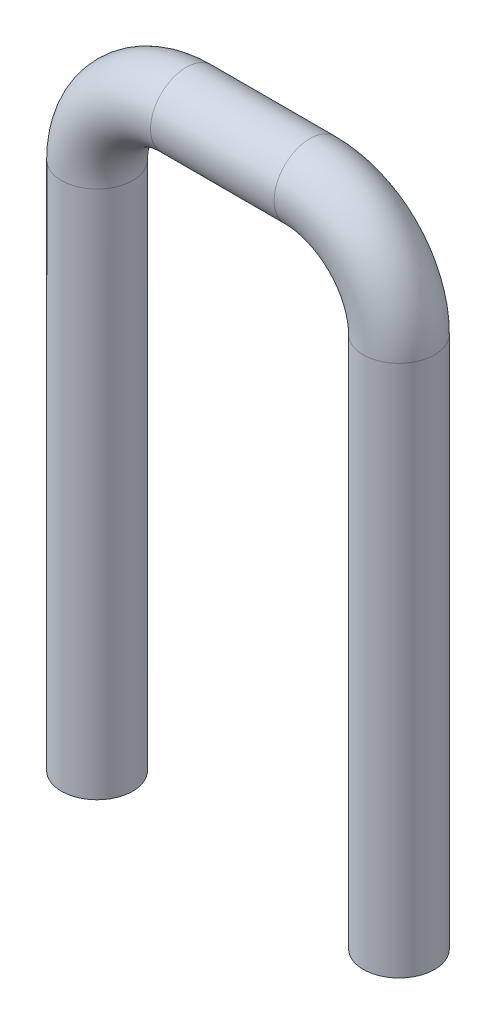
ISO-10303-21;
HEADER;
FILE_DESCRIPTION(('STEP AP214'),'2;1');
FILE_NAME('part.step','',(''),(''),'','','');
FILE_SCHEMA(('AUTOMOTIVE_DESIGN { 1 0 10303 214 1 1 1 1 }'));
ENDSEC;
DATA;
#1=APPLICATION_CONTEXT('core data for automotive mechanical design processes');
#2=APPLICATION_PROTOCOL_DEFINITION('international standard','automotive_design',2000,#1);
#3=PRODUCT_CONTEXT('',#1,'mechanical');
#4=PRODUCT('Part','Part','',(#3));
#5=PRODUCT_RELATED_PRODUCT_CATEGORY('part','',(#4));
#6=PRODUCT_DEFINITION_FORMATION('','',#4);
#7=PRODUCT_DEFINITION_CONTEXT('part definition',#1,'design');
#8=PRODUCT_DEFINITION('design','',#6,#7);
#9=PRODUCT_DEFINITION_SHAPE('','',#8);
#10=(LENGTH_UNIT() NAMED_UNIT(*) SI_UNIT(.MILLI.,.METRE.));
#11=(NAMED_UNIT(*) PLANE_ANGLE_UNIT() SI_UNIT($,.RADIAN.));
#12=(NAMED_UNIT(*) SI_UNIT($,.STERADIAN.) SOLID_ANGLE_UNIT());
#13=UNCERTAINTY_MEASURE_WITH_UNIT(LENGTH_MEASURE(1.E-05),#10,'distance_accuracy_value','');
#14=(GEOMETRIC_REPRESENTATION_CONTEXT(3) GLOBAL_UNCERTAINTY_ASSIGNED_CONTEXT((#13)) GLOBAL_UNIT_ASSIGNED_CONTEXT((#10,
#11,#12)) REPRESENTATION_CONTEXT('',''));
#15=CARTESIAN_POINT('',(0.,0.,0.));
#16=DIRECTION('',(0.,0.,1.));
#17=DIRECTION('',(1.,0.,0.));
#18=AXIS2_PLACEMENT_3D('',#15,#16,#17);
#19=CARTESIAN_POINT('',(0.,0.,0.));
#20=DIRECTION('',(0.,1.,0.));
#21=DIRECTION('',(0.,0.,1.));
#22=AXIS2_PLACEMENT_3D('',#19,#20,#21);
#23=CYLINDRICAL_SURFACE('',#22,0.3);
#24=CARTESIAN_POINT('',(0.,1.85,0.));
#25=DIRECTION('',(0.,1.,0.));
#26=DIRECTION('',(0.,0.,1.));
#27=AXIS2_PLACEMENT_3D('',#24,#25,#26);
#28=CIRCLE('',#27,0.3);
#29=CARTESIAN_POINT('',(-0.3,1.85,0.));
#30=VERTEX_POINT('',#29);
#31=EDGE_CURVE('E55',#30,#30,#28,.T.);
#32=ORIENTED_EDGE('',*,*,#31,.F.);
#33=EDGE_LOOP('',(#32));
#34=FACE_BOUND('',#33,.T.);
#35=CARTESIAN_POINT('',(0.,-2.6,0.));
#36=DIRECTION('',(0.,-1.,0.));
#37=DIRECTION('',(0.,0.,-1.));
#38=AXIS2_PLACEMENT_3D('',#35,#36,#37);
#39=CIRCLE('',#38,0.3);
#40=CARTESIAN_POINT('',(0.,-2.6,-0.3));
#41=VERTEX_POINT('',#40);
#42=EDGE_CURVE('E61',#41,#41,#39,.T.);
#43=ORIENTED_EDGE('',*,*,#42,.F.);
#44=EDGE_LOOP('',(#43));
#45=FACE_BOUND('',#44,.T.);
#46=ADVANCED_FACE('F37',(#34,#45),#23,.T.);
#47=CARTESIAN_POINT('',(0.75,1.85,0.));
#48=DIRECTION('',(0.,0.,-1.));
#49=DIRECTION('',(-1.,0.,0.));
#50=AXIS2_PLACEMENT_3D('',#47,#48,#49);
#51=TOROIDAL_SURFACE('',#50,0.75,0.3);
#52=CARTESIAN_POINT('',(0.75,2.6,0.));
#53=DIRECTION('',(1.,0.,0.));
#54=DIRECTION('',(0.,0.,1.));
#55=AXIS2_PLACEMENT_3D('',#52,#53,#54);
#56=CIRCLE('',#55,0.3);
#57=CARTESIAN_POINT('',(0.75,2.9,0.));
#58=VERTEX_POINT('',#57);
#59=EDGE_CURVE('E50',#58,#58,#56,.T.);
#60=CARTESIAN_POINT('',(0.75,1.85,0.));
#61=DIRECTION('',(0.,0.,-1.));
#62=DIRECTION('',(-1.,0.,0.));
#63=AXIS2_PLACEMENT_3D('',#60,#61,#62);
#64=CIRCLE('',#63,1.05);
#65=EDGE_CURVE('',#30,#58,#64,.T.);
#66=ORIENTED_EDGE('',*,*,#31,.T.);
#67=ORIENTED_EDGE('',*,*,#59,.F.);
#68=ORIENTED_EDGE('',*,*,#65,.T.);
#69=ORIENTED_EDGE('',*,*,#65,.F.);
#70=EDGE_LOOP('',(#66,#68,#67,#69));
#71=FACE_BOUND('',#70,.T.);
#72=ADVANCED_FACE('F86',(#71),#51,.T.);
#73=CARTESIAN_POINT('',(0.75,2.6,0.));
#74=DIRECTION('',(1.,0.,0.));
#75=DIRECTION('',(0.,0.,-1.));
#76=AXIS2_PLACEMENT_3D('',#73,#74,#75);
#77=CYLINDRICAL_SURFACE('',#76,0.3);
#78=CARTESIAN_POINT('',(1.79,2.6,0.));
#79=DIRECTION('',(1.,0.,0.));
#80=DIRECTION('',(0.,0.,1.));
#81=AXIS2_PLACEMENT_3D('',#78,#79,#80);
#82=CIRCLE('',#81,0.3);
#83=CARTESIAN_POINT('',(1.79,2.9,0.));
#84=VERTEX_POINT('',#83);
#85=EDGE_CURVE('E45',#84,#84,#82,.T.);
#86=ORIENTED_EDGE('',*,*,#85,.F.);
#87=EDGE_LOOP('',(#86));
#88=FACE_BOUND('',#87,.T.);
#89=ORIENTED_EDGE('',*,*,#59,.T.);
#90=EDGE_LOOP('',(#89));
#91=FACE_BOUND('',#90,.T.);
#92=ADVANCED_FACE('F81',(#88,#91),#77,.T.);
#93=CARTESIAN_POINT('',(1.79,1.85,0.));
#94=DIRECTION('',(0.,0.,-1.));
#95=DIRECTION('',(-1.,0.,0.));
#96=AXIS2_PLACEMENT_3D('',#93,#94,#95);
#97=TOROIDAL_SURFACE('',#96,0.75,0.3);
#98=CARTESIAN_POINT('',(2.54,1.85,0.));
#99=DIRECTION('',(0.,-1.,0.));
#100=DIRECTION('',(0.,0.,1.));
#101=AXIS2_PLACEMENT_3D('',#98,#99,#100);
#102=CIRCLE('',#101,0.3);
#103=CARTESIAN_POINT('',(2.84,1.85,0.));
#104=VERTEX_POINT('',#103);
#105=EDGE_CURVE('E10',#104,#104,#102,.T.);
#106=CARTESIAN_POINT('',(1.79,1.85,0.));
#107=DIRECTION('',(0.,0.,-1.));
#108=DIRECTION('',(-1.,0.,0.));
#109=AXIS2_PLACEMENT_3D('',#106,#107,#108);
#110=CIRCLE('',#109,1.05);
#111=EDGE_CURVE('',#84,#104,#110,.T.);
#112=ORIENTED_EDGE('',*,*,#85,.T.);
#113=ORIENTED_EDGE('',*,*,#105,.F.);
#114=ORIENTED_EDGE('',*,*,#111,.T.);
#115=ORIENTED_EDGE('',*,*,#111,.F.);
#116=EDGE_LOOP('',(#112,#114,#113,#115));
#117=FACE_BOUND('',#116,.T.);
#118=ADVANCED_FACE('F74',(#117),#97,.T.);
#119=CARTESIAN_POINT('',(2.54,1.85,0.));
#120=DIRECTION('',(0.,-1.,0.));
#121=DIRECTION('',(1.,0.,0.));
#122=AXIS2_PLACEMENT_3D('',#119,#120,#121);
#123=CYLINDRICAL_SURFACE('',#122,0.3);
#124=ORIENTED_EDGE('',*,*,#105,.T.);
#125=EDGE_LOOP('',(#124));
#126=FACE_BOUND('',#125,.T.);
#127=CARTESIAN_POINT('',(2.54,-2.6285295528343,0.));
#128=DIRECTION('',(0.,-1.,0.));
#129=DIRECTION('',(1.,0.,0.));
#130=AXIS2_PLACEMENT_3D('',#127,#128,#129);
#131=CIRCLE('',#130,0.3);
#132=CARTESIAN_POINT('',(2.84,-2.6285295528343,0.));
#133=VERTEX_POINT('',#132);
#134=EDGE_CURVE('E65',#133,#133,#131,.T.);
#135=ORIENTED_EDGE('',*,*,#134,.F.);
#136=EDGE_LOOP('',(#135));
#137=FACE_BOUND('',#136,.T.);
#138=ADVANCED_FACE('F39',(#126,#137),#123,.T.);
#139=CARTESIAN_POINT('',(0.,-2.6,0.));
#140=DIRECTION('',(0.,-1.,0.));
#141=DIRECTION('',(0.,0.,-1.));
#142=AXIS2_PLACEMENT_3D('',#139,#140,#141);
#143=PLANE('',#142);
#144=ORIENTED_EDGE('',*,*,#42,.T.);
#145=EDGE_LOOP('',(#144));
#146=FACE_BOUND('',#145,.T.);
#147=ADVANCED_FACE('F73',(#146),#143,.T.);
#148=CARTESIAN_POINT('',(2.54,-2.6285295528343,0.));
#149=DIRECTION('',(0.,-1.,0.));
#150=DIRECTION('',(1.,0.,0.));
#151=AXIS2_PLACEMENT_3D('',#148,#149,#150);
#152=PLANE('',#151);
#153=ORIENTED_EDGE('',*,*,#134,.T.);
#154=EDGE_LOOP('',(#153));
#155=FACE_BOUND('',#154,.T.);
#156=ADVANCED_FACE('F70',(#155),#152,.T.);
#157=CLOSED_SHELL('',(#46,#72,#92,#118,#138,#147,#156));
#158=MANIFOLD_SOLID_BREP('B2',#157);
#159=ADVANCED_BREP_SHAPE_REPRESENTATION('',(#18,#158),#14);
#160=SHAPE_DEFINITION_REPRESENTATION(#9,#159);
ENDSEC;
END-ISO-10303-21;
